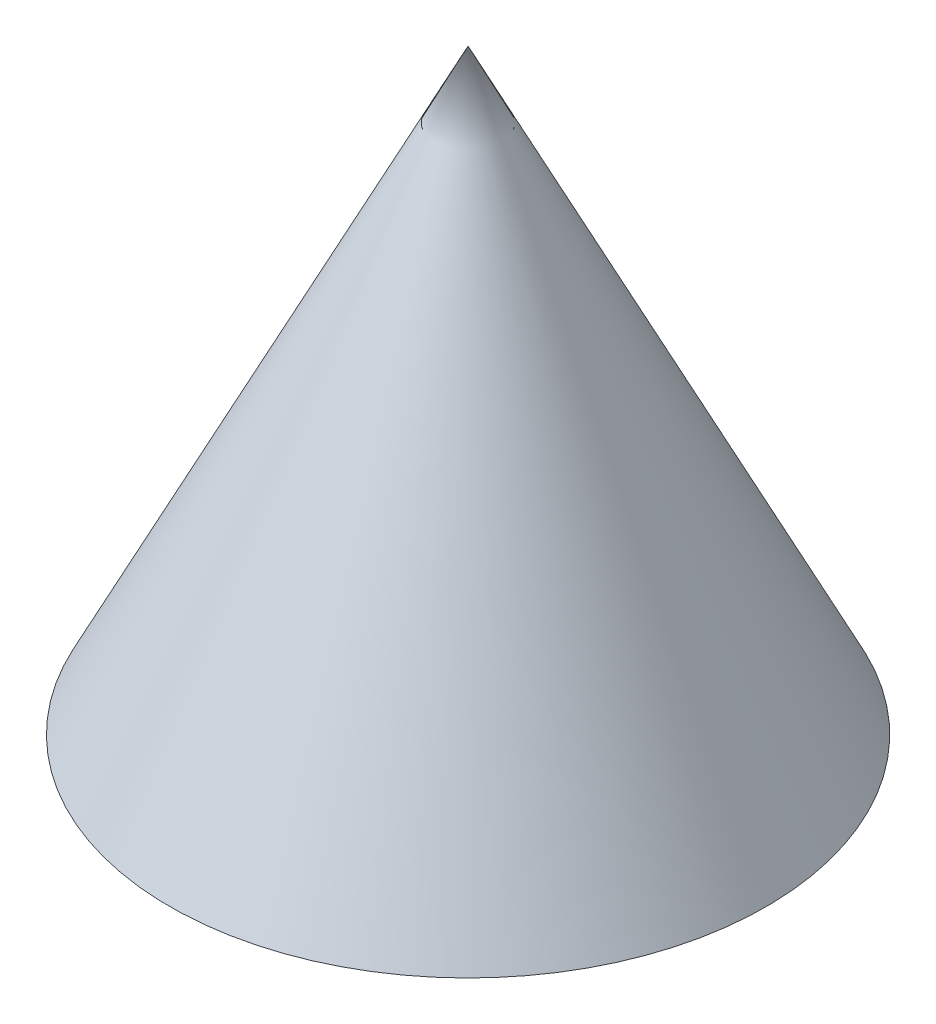
ISO-10303-21;
HEADER;
FILE_DESCRIPTION(('STEP AP214'),'2;1');
FILE_NAME('part.step','',(''),(''),'','','');
FILE_SCHEMA(('AUTOMOTIVE_DESIGN { 1 0 10303 214 1 1 1 1 }'));
ENDSEC;
DATA;
#1=APPLICATION_CONTEXT('core data for automotive mechanical design processes');
#2=APPLICATION_PROTOCOL_DEFINITION('international standard','automotive_design',2000,#1);
#3=PRODUCT_CONTEXT('',#1,'mechanical');
#4=PRODUCT('Part','Part','',(#3));
#5=PRODUCT_RELATED_PRODUCT_CATEGORY('part','',(#4));
#6=PRODUCT_DEFINITION_FORMATION('','',#4);
#7=PRODUCT_DEFINITION_CONTEXT('part definition',#1,'design');
#8=PRODUCT_DEFINITION('design','',#6,#7);
#9=PRODUCT_DEFINITION_SHAPE('','',#8);
#10=(LENGTH_UNIT() NAMED_UNIT(*) SI_UNIT(.MILLI.,.METRE.));
#11=(NAMED_UNIT(*) PLANE_ANGLE_UNIT() SI_UNIT($,.RADIAN.));
#12=(NAMED_UNIT(*) SI_UNIT($,.STERADIAN.) SOLID_ANGLE_UNIT());
#13=UNCERTAINTY_MEASURE_WITH_UNIT(LENGTH_MEASURE(1.E-05),#10,'distance_accuracy_value','');
#14=(GEOMETRIC_REPRESENTATION_CONTEXT(3) GLOBAL_UNCERTAINTY_ASSIGNED_CONTEXT((#13)) GLOBAL_UNIT_ASSIGNED_CONTEXT((#10,
#11,#12)) REPRESENTATION_CONTEXT('',''));
#15=CARTESIAN_POINT('',(0.,0.,0.));
#16=DIRECTION('',(0.,0.,1.));
#17=DIRECTION('',(1.,0.,0.));
#18=AXIS2_PLACEMENT_3D('',#15,#16,#17);
#19=CARTESIAN_POINT('',(25.,0.,0.));
#20=DIRECTION('',(0.,-1.,0.));
#21=DIRECTION('',(0.,0.,-1.));
#22=AXIS2_PLACEMENT_3D('',#19,#20,#21);
#23=PLANE('',#22);
#24=CARTESIAN_POINT('',(0.,0.,0.));
#25=DIRECTION('',(0.,-1.,0.));
#26=DIRECTION('',(0.,0.,-1.));
#27=AXIS2_PLACEMENT_3D('',#24,#25,#26);
#28=CIRCLE('',#27,25.);
#29=CARTESIAN_POINT('',(0.,0.,-25.));
#30=VERTEX_POINT('',#29);
#31=EDGE_CURVE('E11',#30,#30,#28,.T.);
#32=ORIENTED_EDGE('',*,*,#31,.T.);
#33=EDGE_LOOP('',(#32));
#34=FACE_BOUND('',#33,.T.);
#35=ADVANCED_FACE('F36',(#34),#23,.T.);
#36=CARTESIAN_POINT('',(0.,0.,0.));
#37=DIRECTION('',(0.,-1.,0.));
#38=DIRECTION('',(0.,0.,-1.));
#39=AXIS2_PLACEMENT_3D('',#36,#37,#38);
#40=CONICAL_SURFACE('',#39,25.,0.463647609000806);
#41=CARTESIAN_POINT('',(0.,50.,0.));
#42=VERTEX_POINT('',#41);
#43=VERTEX_LOOP('',#42);
#44=FACE_BOUND('',#43,.T.);
#45=ORIENTED_EDGE('',*,*,#31,.F.);
#46=EDGE_LOOP('',(#45));
#47=FACE_BOUND('',#46,.T.);
#48=ADVANCED_FACE('F43',(#44,#47),#40,.T.);
#49=CLOSED_SHELL('',(#35,#48));
#50=MANIFOLD_SOLID_BREP('B2',#49);
#51=ADVANCED_BREP_SHAPE_REPRESENTATION('',(#18,#50),#14);
#52=SHAPE_DEFINITION_REPRESENTATION(#9,#51);
ENDSEC;
END-ISO-10303-21;
